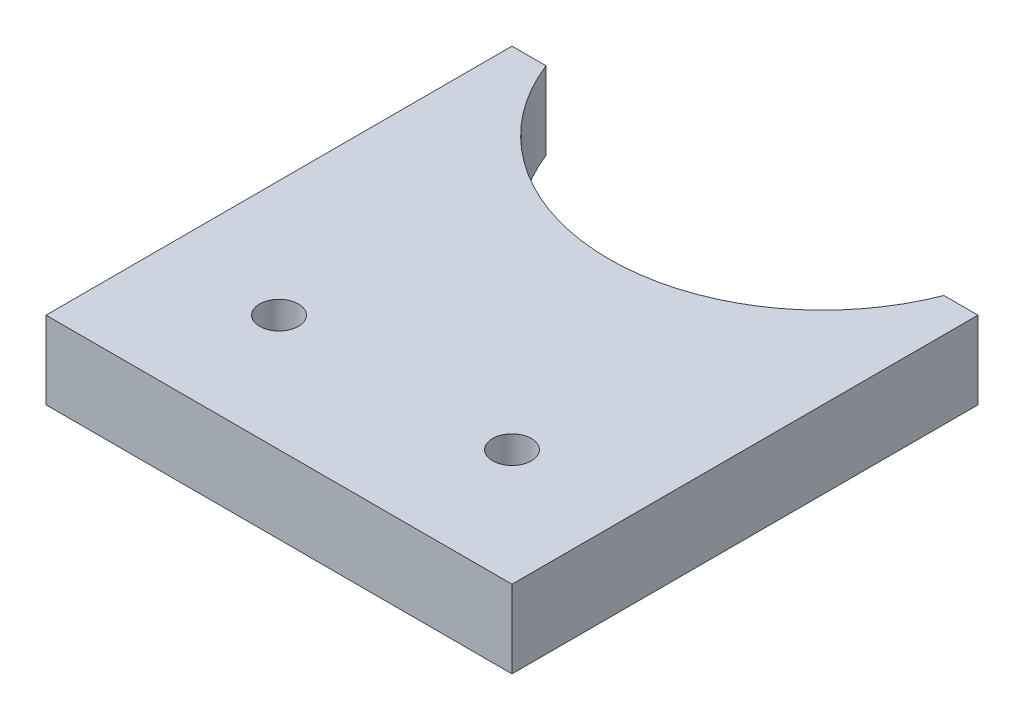
ISO-10303-21;
HEADER;
FILE_DESCRIPTION(('STEP AP214'),'2;1');
FILE_NAME('part.step','',(''),(''),'','','');
FILE_SCHEMA(('AUTOMOTIVE_DESIGN { 1 0 10303 214 1 1 1 1 }'));
ENDSEC;
DATA;
#1=APPLICATION_CONTEXT('core data for automotive mechanical design processes');
#2=APPLICATION_PROTOCOL_DEFINITION('international standard','automotive_design',2000,#1);
#3=PRODUCT_CONTEXT('',#1,'mechanical');
#4=PRODUCT('Part','Part','',(#3));
#5=PRODUCT_RELATED_PRODUCT_CATEGORY('part','',(#4));
#6=PRODUCT_DEFINITION_FORMATION('','',#4);
#7=PRODUCT_DEFINITION_CONTEXT('part definition',#1,'design');
#8=PRODUCT_DEFINITION('design','',#6,#7);
#9=PRODUCT_DEFINITION_SHAPE('','',#8);
#10=(LENGTH_UNIT() NAMED_UNIT(*) SI_UNIT(.MILLI.,.METRE.));
#11=(NAMED_UNIT(*) PLANE_ANGLE_UNIT() SI_UNIT($,.RADIAN.));
#12=(NAMED_UNIT(*) SI_UNIT($,.STERADIAN.) SOLID_ANGLE_UNIT());
#13=UNCERTAINTY_MEASURE_WITH_UNIT(LENGTH_MEASURE(1.E-05),#10,'distance_accuracy_value','');
#14=(GEOMETRIC_REPRESENTATION_CONTEXT(3) GLOBAL_UNCERTAINTY_ASSIGNED_CONTEXT((#13)) GLOBAL_UNIT_ASSIGNED_CONTEXT((#10,
#11,#12)) REPRESENTATION_CONTEXT('',''));
#15=CARTESIAN_POINT('',(0.,0.,0.));
#16=DIRECTION('',(0.,0.,1.));
#17=DIRECTION('',(1.,0.,0.));
#18=AXIS2_PLACEMENT_3D('',#15,#16,#17);
#19=CARTESIAN_POINT('',(38.1,12.7,38.1));
#20=DIRECTION('',(0.,0.,-1.));
#21=DIRECTION('',(-1.,0.,0.));
#22=AXIS2_PLACEMENT_3D('',#19,#20,#21);
#23=PLANE('',#22);
#24=DIRECTION('',(1.,0.,0.));
#25=VECTOR('',#24,1.);
#26=CARTESIAN_POINT('',(38.1,0.,38.1));
#27=LINE('',#26,#25);
#28=CARTESIAN_POINT('',(-38.1,0.,38.1));
#29=VERTEX_POINT('',#28);
#30=CARTESIAN_POINT('',(38.1,0.,38.1));
#31=VERTEX_POINT('',#30);
#32=EDGE_CURVE('E116',#29,#31,#27,.T.);
#33=ORIENTED_EDGE('',*,*,#32,.T.);
#34=DIRECTION('',(0.,-1.,0.));
#35=VECTOR('',#34,1.);
#36=CARTESIAN_POINT('',(38.1,12.7,38.1));
#37=LINE('',#36,#35);
#38=CARTESIAN_POINT('',(38.1,12.7,38.1));
#39=VERTEX_POINT('',#38);
#40=EDGE_CURVE('E11',#39,#31,#37,.T.);
#41=ORIENTED_EDGE('',*,*,#40,.F.);
#42=DIRECTION('',(1.,0.,0.));
#43=VECTOR('',#42,1.);
#44=CARTESIAN_POINT('',(38.1,12.7,38.1));
#45=LINE('',#44,#43);
#46=CARTESIAN_POINT('',(-38.1,12.7,38.1));
#47=VERTEX_POINT('',#46);
#48=EDGE_CURVE('E127',#47,#39,#45,.T.);
#49=ORIENTED_EDGE('',*,*,#48,.F.);
#50=DIRECTION('',(0.,-1.,0.));
#51=VECTOR('',#50,1.);
#52=CARTESIAN_POINT('',(-38.1,12.7,38.1));
#53=LINE('',#52,#51);
#54=EDGE_CURVE('E112',#47,#29,#53,.T.);
#55=ORIENTED_EDGE('',*,*,#54,.T.);
#56=EDGE_LOOP('',(#33,#41,#49,#55));
#57=FACE_BOUND('',#56,.T.);
#58=ADVANCED_FACE('F32',(#57),#23,.F.);
#59=CARTESIAN_POINT('',(38.1,12.7,-38.1));
#60=DIRECTION('',(-1.,0.,0.));
#61=DIRECTION('',(0.,0.,1.));
#62=AXIS2_PLACEMENT_3D('',#59,#60,#61);
#63=PLANE('',#62);
#64=DIRECTION('',(0.,0.,-1.));
#65=VECTOR('',#64,1.);
#66=CARTESIAN_POINT('',(38.1,0.,-38.1));
#67=LINE('',#66,#65);
#68=CARTESIAN_POINT('',(38.1,0.,-38.1));
#69=VERTEX_POINT('',#68);
#70=EDGE_CURVE('E119',#31,#69,#67,.T.);
#71=ORIENTED_EDGE('',*,*,#70,.T.);
#72=DIRECTION('',(0.,-1.,0.));
#73=VECTOR('',#72,1.);
#74=CARTESIAN_POINT('',(38.1,12.7,-38.1));
#75=LINE('',#74,#73);
#76=CARTESIAN_POINT('',(38.1,12.7,-38.1));
#77=VERTEX_POINT('',#76);
#78=EDGE_CURVE('E40',#77,#69,#75,.T.);
#79=ORIENTED_EDGE('',*,*,#78,.F.);
#80=DIRECTION('',(0.,0.,-1.));
#81=VECTOR('',#80,1.);
#82=CARTESIAN_POINT('',(38.1,12.7,-38.1));
#83=LINE('',#82,#81);
#84=EDGE_CURVE('E85',#39,#77,#83,.T.);
#85=ORIENTED_EDGE('',*,*,#84,.F.);
#86=ORIENTED_EDGE('',*,*,#40,.T.);
#87=EDGE_LOOP('',(#71,#79,#85,#86));
#88=FACE_BOUND('',#87,.T.);
#89=ADVANCED_FACE('F152',(#88),#63,.F.);
#90=CARTESIAN_POINT('',(38.1,12.7,-38.1));
#91=DIRECTION('',(0.,0.,1.));
#92=DIRECTION('',(1.,0.,0.));
#93=AXIS2_PLACEMENT_3D('',#90,#91,#92);
#94=PLANE('',#93);
#95=DIRECTION('',(-1.,0.,0.));
#96=VECTOR('',#95,1.);
#97=CARTESIAN_POINT('',(38.1,0.,-38.1));
#98=LINE('',#97,#96);
#99=CARTESIAN_POINT('',(32.5340686819217,0.,-38.1));
#100=VERTEX_POINT('',#99);
#101=EDGE_CURVE('E122',#69,#100,#98,.T.);
#102=ORIENTED_EDGE('',*,*,#101,.T.);
#103=DIRECTION('',(0.,-1.,0.));
#104=VECTOR('',#103,1.);
#105=CARTESIAN_POINT('',(32.5340686819217,12.7,-38.1));
#106=LINE('',#105,#104);
#107=CARTESIAN_POINT('',(32.5340686819217,12.7,-38.1));
#108=VERTEX_POINT('',#107);
#109=EDGE_CURVE('E107',#108,#100,#106,.T.);
#110=ORIENTED_EDGE('',*,*,#109,.F.);
#111=DIRECTION('',(-1.,0.,0.));
#112=VECTOR('',#111,1.);
#113=CARTESIAN_POINT('',(38.1,12.7,-38.1));
#114=LINE('',#113,#112);
#115=EDGE_CURVE('E98',#77,#108,#114,.T.);
#116=ORIENTED_EDGE('',*,*,#115,.F.);
#117=ORIENTED_EDGE('',*,*,#78,.T.);
#118=EDGE_LOOP('',(#102,#110,#116,#117));
#119=FACE_BOUND('',#118,.T.);
#120=ADVANCED_FACE('F133',(#119),#94,.F.);
#121=CARTESIAN_POINT('',(0.,12.7,-50.8));
#122=DIRECTION('',(0.,-1.,0.));
#123=DIRECTION('',(0.,0.,-1.));
#124=AXIS2_PLACEMENT_3D('',#121,#122,#123);
#125=CYLINDRICAL_SURFACE('',#124,34.925);
#126=CARTESIAN_POINT('',(0.,0.,-50.8));
#127=DIRECTION('',(0.,-1.,0.));
#128=DIRECTION('',(0.,0.,1.));
#129=AXIS2_PLACEMENT_3D('',#126,#127,#128);
#130=CIRCLE('',#129,34.925);
#131=CARTESIAN_POINT('',(-32.5340686819217,0.,-38.1));
#132=VERTEX_POINT('',#131);
#133=EDGE_CURVE('E106',#100,#132,#130,.T.);
#134=ORIENTED_EDGE('',*,*,#133,.T.);
#135=DIRECTION('',(0.,-1.,0.));
#136=VECTOR('',#135,1.);
#137=CARTESIAN_POINT('',(-32.5340686819217,12.7,-38.1));
#138=LINE('',#137,#136);
#139=CARTESIAN_POINT('',(-32.5340686819217,12.7,-38.1));
#140=VERTEX_POINT('',#139);
#141=EDGE_CURVE('E103',#140,#132,#138,.T.);
#142=ORIENTED_EDGE('',*,*,#141,.F.);
#143=CARTESIAN_POINT('',(0.,12.7,-50.8));
#144=DIRECTION('',(0.,-1.,0.));
#145=DIRECTION('',(0.,0.,1.));
#146=AXIS2_PLACEMENT_3D('',#143,#144,#145);
#147=CIRCLE('',#146,34.925);
#148=EDGE_CURVE('E92',#108,#140,#147,.T.);
#149=ORIENTED_EDGE('',*,*,#148,.F.);
#150=ORIENTED_EDGE('',*,*,#109,.T.);
#151=EDGE_LOOP('',(#134,#142,#149,#150));
#152=FACE_BOUND('',#151,.T.);
#153=ADVANCED_FACE('F104',(#152),#125,.F.);
#154=CARTESIAN_POINT('',(-32.5340686819217,12.7,-38.1));
#155=DIRECTION('',(0.,0.,1.));
#156=DIRECTION('',(1.,0.,0.));
#157=AXIS2_PLACEMENT_3D('',#154,#155,#156);
#158=PLANE('',#157);
#159=DIRECTION('',(-1.,0.,0.));
#160=VECTOR('',#159,1.);
#161=CARTESIAN_POINT('',(-32.5340686819217,0.,-38.1));
#162=LINE('',#161,#160);
#163=CARTESIAN_POINT('',(-38.1,0.,-38.1));
#164=VERTEX_POINT('',#163);
#165=EDGE_CURVE('E71',#132,#164,#162,.T.);
#166=ORIENTED_EDGE('',*,*,#165,.T.);
#167=DIRECTION('',(0.,-1.,0.));
#168=VECTOR('',#167,1.);
#169=CARTESIAN_POINT('',(-38.1,12.7,-38.1));
#170=LINE('',#169,#168);
#171=CARTESIAN_POINT('',(-38.1,12.7,-38.1));
#172=VERTEX_POINT('',#171);
#173=EDGE_CURVE('E108',#172,#164,#170,.T.);
#174=ORIENTED_EDGE('',*,*,#173,.F.);
#175=DIRECTION('',(-1.,0.,0.));
#176=VECTOR('',#175,1.);
#177=CARTESIAN_POINT('',(-32.5340686819217,12.7,-38.1));
#178=LINE('',#177,#176);
#179=EDGE_CURVE('E96',#140,#172,#178,.T.);
#180=ORIENTED_EDGE('',*,*,#179,.F.);
#181=ORIENTED_EDGE('',*,*,#141,.T.);
#182=EDGE_LOOP('',(#166,#174,#180,#181));
#183=FACE_BOUND('',#182,.T.);
#184=ADVANCED_FACE('F110',(#183),#158,.F.);
#185=CARTESIAN_POINT('',(-38.1,12.7,-38.1));
#186=DIRECTION('',(1.,0.,0.));
#187=DIRECTION('',(0.,0.,-1.));
#188=AXIS2_PLACEMENT_3D('',#185,#186,#187);
#189=PLANE('',#188);
#190=DIRECTION('',(0.,0.,1.));
#191=VECTOR('',#190,1.);
#192=CARTESIAN_POINT('',(-38.1,0.,-38.1));
#193=LINE('',#192,#191);
#194=EDGE_CURVE('E77',#164,#29,#193,.T.);
#195=ORIENTED_EDGE('',*,*,#194,.T.);
#196=ORIENTED_EDGE('',*,*,#54,.F.);
#197=DIRECTION('',(0.,0.,1.));
#198=VECTOR('',#197,1.);
#199=CARTESIAN_POINT('',(-38.1,12.7,-38.1));
#200=LINE('',#199,#198);
#201=EDGE_CURVE('E48',#172,#47,#200,.T.);
#202=ORIENTED_EDGE('',*,*,#201,.F.);
#203=ORIENTED_EDGE('',*,*,#173,.T.);
#204=EDGE_LOOP('',(#195,#196,#202,#203));
#205=FACE_BOUND('',#204,.T.);
#206=ADVANCED_FACE('F140',(#205),#189,.F.);
#207=CARTESIAN_POINT('',(0.,12.7,-50.8));
#208=DIRECTION('',(0.,1.,0.));
#209=DIRECTION('',(0.,0.,1.));
#210=AXIS2_PLACEMENT_3D('',#207,#208,#209);
#211=PLANE('',#210);
#212=CARTESIAN_POINT('',(19.05,12.7,19.05));
#213=DIRECTION('',(0.,1.,0.));
#214=DIRECTION('',(0.,0.,-1.));
#215=AXIS2_PLACEMENT_3D('',#212,#213,#214);
#216=CIRCLE('',#215,3.175);
#217=CARTESIAN_POINT('',(19.05,12.7,15.875));
#218=VERTEX_POINT('',#217);
#219=EDGE_CURVE('E218',#218,#218,#216,.T.);
#220=ORIENTED_EDGE('',*,*,#219,.F.);
#221=EDGE_LOOP('',(#220));
#222=FACE_BOUND('',#221,.T.);
#223=CARTESIAN_POINT('',(-19.05,12.7,19.05));
#224=DIRECTION('',(0.,1.,0.));
#225=DIRECTION('',(0.,0.,1.));
#226=AXIS2_PLACEMENT_3D('',#223,#224,#225);
#227=CIRCLE('',#226,3.175);
#228=CARTESIAN_POINT('',(-19.05,12.7,22.225));
#229=VERTEX_POINT('',#228);
#230=EDGE_CURVE('E220',#229,#229,#227,.T.);
#231=ORIENTED_EDGE('',*,*,#230,.F.);
#232=EDGE_LOOP('',(#231));
#233=FACE_BOUND('',#232,.T.);
#234=ORIENTED_EDGE('',*,*,#48,.T.);
#235=ORIENTED_EDGE('',*,*,#84,.T.);
#236=ORIENTED_EDGE('',*,*,#115,.T.);
#237=ORIENTED_EDGE('',*,*,#148,.T.);
#238=ORIENTED_EDGE('',*,*,#179,.T.);
#239=ORIENTED_EDGE('',*,*,#201,.T.);
#240=EDGE_LOOP('',(#234,#235,#236,#237,#238,#239));
#241=FACE_BOUND('',#240,.T.);
#242=ADVANCED_FACE('F94',(#222,#233,#241),#211,.T.);
#243=CARTESIAN_POINT('',(0.,0.,-50.8));
#244=DIRECTION('',(0.,1.,0.));
#245=DIRECTION('',(0.,0.,1.));
#246=AXIS2_PLACEMENT_3D('',#243,#244,#245);
#247=PLANE('',#246);
#248=CARTESIAN_POINT('',(19.05,0.,19.05));
#249=DIRECTION('',(0.,1.,0.));
#250=DIRECTION('',(0.,0.,-1.));
#251=AXIS2_PLACEMENT_3D('',#248,#249,#250);
#252=CIRCLE('',#251,3.175);
#253=CARTESIAN_POINT('',(19.05,0.,15.875));
#254=VERTEX_POINT('',#253);
#255=EDGE_CURVE('E215',#254,#254,#252,.T.);
#256=ORIENTED_EDGE('',*,*,#255,.T.);
#257=EDGE_LOOP('',(#256));
#258=FACE_BOUND('',#257,.T.);
#259=CARTESIAN_POINT('',(-19.05,0.,19.05));
#260=DIRECTION('',(0.,1.,0.));
#261=DIRECTION('',(0.,0.,1.));
#262=AXIS2_PLACEMENT_3D('',#259,#260,#261);
#263=CIRCLE('',#262,3.175);
#264=CARTESIAN_POINT('',(-19.05,0.,22.225));
#265=VERTEX_POINT('',#264);
#266=EDGE_CURVE('E120',#265,#265,#263,.T.);
#267=ORIENTED_EDGE('',*,*,#266,.T.);
#268=EDGE_LOOP('',(#267));
#269=FACE_BOUND('',#268,.T.);
#270=ORIENTED_EDGE('',*,*,#32,.F.);
#271=ORIENTED_EDGE('',*,*,#194,.F.);
#272=ORIENTED_EDGE('',*,*,#165,.F.);
#273=ORIENTED_EDGE('',*,*,#133,.F.);
#274=ORIENTED_EDGE('',*,*,#101,.F.);
#275=ORIENTED_EDGE('',*,*,#70,.F.);
#276=EDGE_LOOP('',(#270,#271,#272,#273,#274,#275));
#277=FACE_BOUND('',#276,.T.);
#278=ADVANCED_FACE('F136',(#258,#269,#277),#247,.F.);
#279=CARTESIAN_POINT('',(-19.05,0.,19.05));
#280=DIRECTION('',(0.,1.,0.));
#281=DIRECTION('',(0.,0.,1.));
#282=AXIS2_PLACEMENT_3D('',#279,#280,#281);
#283=CYLINDRICAL_SURFACE('',#282,3.175);
#284=ORIENTED_EDGE('',*,*,#266,.F.);
#285=EDGE_LOOP('',(#284));
#286=FACE_BOUND('',#285,.T.);
#287=ORIENTED_EDGE('',*,*,#230,.T.);
#288=EDGE_LOOP('',(#287));
#289=FACE_BOUND('',#288,.T.);
#290=ADVANCED_FACE('F189',(#286,#289),#283,.F.);
#291=CARTESIAN_POINT('',(19.05,0.,19.05));
#292=DIRECTION('',(0.,1.,0.));
#293=DIRECTION('',(0.,0.,1.));
#294=AXIS2_PLACEMENT_3D('',#291,#292,#293);
#295=CYLINDRICAL_SURFACE('',#294,3.175);
#296=ORIENTED_EDGE('',*,*,#255,.F.);
#297=EDGE_LOOP('',(#296));
#298=FACE_BOUND('',#297,.T.);
#299=ORIENTED_EDGE('',*,*,#219,.T.);
#300=EDGE_LOOP('',(#299));
#301=FACE_BOUND('',#300,.T.);
#302=ADVANCED_FACE('F198',(#298,#301),#295,.F.);
#303=CLOSED_SHELL('',(#58,#89,#120,#153,#184,#206,#242,#278,#290,#302));
#304=MANIFOLD_SOLID_BREP('B2',#303);
#305=ADVANCED_BREP_SHAPE_REPRESENTATION('',(#18,#304),#14);
#306=SHAPE_DEFINITION_REPRESENTATION(#9,#305);
ENDSEC;
END-ISO-10303-21;
